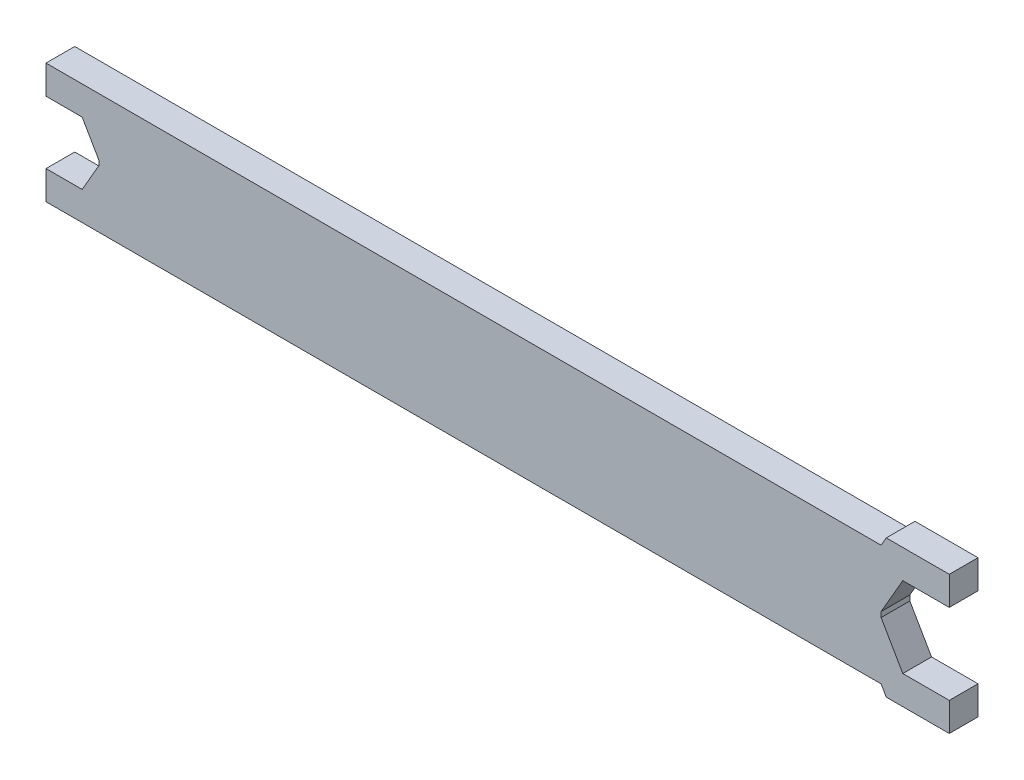
ISO-10303-21;
HEADER;
FILE_DESCRIPTION(('STEP AP214'),'2;1');
FILE_NAME('part.step','',(''),(''),'','','');
FILE_SCHEMA(('AUTOMOTIVE_DESIGN { 1 0 10303 214 1 1 1 1 }'));
ENDSEC;
DATA;
#1=APPLICATION_CONTEXT('core data for automotive mechanical design processes');
#2=APPLICATION_PROTOCOL_DEFINITION('international standard','automotive_design',2000,#1);
#3=PRODUCT_CONTEXT('',#1,'mechanical');
#4=PRODUCT('Part','Part','',(#3));
#5=PRODUCT_RELATED_PRODUCT_CATEGORY('part','',(#4));
#6=PRODUCT_DEFINITION_FORMATION('','',#4);
#7=PRODUCT_DEFINITION_CONTEXT('part definition',#1,'design');
#8=PRODUCT_DEFINITION('design','',#6,#7);
#9=PRODUCT_DEFINITION_SHAPE('','',#8);
#10=(LENGTH_UNIT() NAMED_UNIT(*) SI_UNIT(.MILLI.,.METRE.));
#11=(NAMED_UNIT(*) PLANE_ANGLE_UNIT() SI_UNIT($,.RADIAN.));
#12=(NAMED_UNIT(*) SI_UNIT($,.STERADIAN.) SOLID_ANGLE_UNIT());
#13=UNCERTAINTY_MEASURE_WITH_UNIT(LENGTH_MEASURE(1.E-05),#10,'distance_accuracy_value','');
#14=(GEOMETRIC_REPRESENTATION_CONTEXT(3) GLOBAL_UNCERTAINTY_ASSIGNED_CONTEXT((#13)) GLOBAL_UNIT_ASSIGNED_CONTEXT((#10,
#11,#12)) REPRESENTATION_CONTEXT('',''));
#15=CARTESIAN_POINT('',(0.,0.,0.));
#16=DIRECTION('',(0.,0.,1.));
#17=DIRECTION('',(1.,0.,0.));
#18=AXIS2_PLACEMENT_3D('',#15,#16,#17);
#19=CARTESIAN_POINT('',(51.8707091385298,-29.9475678841873,2.54));
#20=DIRECTION('',(-0.866025403784436,0.500000000000004,0.));
#21=DIRECTION('',(-0.500000000000004,-0.866025403784436,0.));
#22=AXIS2_PLACEMENT_3D('',#19,#20,#21);
#23=PLANE('',#22);
#24=DIRECTION('',(0.,0.,1.));
#25=VECTOR('',#24,1.);
#26=CARTESIAN_POINT('',(72.2258671570601,5.30860000000001,-69.9711463446849));
#27=LINE('',#26,#25);
#28=CARTESIAN_POINT('',(72.2258671570601,5.30860000000001,0.));
#29=VERTEX_POINT('',#28);
#30=CARTESIAN_POINT('',(72.2258671570601,5.30860000000001,2.54));
#31=VERTEX_POINT('',#30);
#32=EDGE_CURVE('E369',#29,#31,#27,.T.);
#33=ORIENTED_EDGE('',*,*,#32,.T.);
#34=DIRECTION('',(0.500000000000004,0.866025403784436,0.));
#35=VECTOR('',#34,1.);
#36=CARTESIAN_POINT('',(51.8707091385298,-29.9475678841873,2.54));
#37=LINE('',#36,#35);
#38=CARTESIAN_POINT('',(72.6804727590201,6.09600000000001,2.54));
#39=VERTEX_POINT('',#38);
#40=EDGE_CURVE('E58',#31,#39,#37,.T.);
#41=ORIENTED_EDGE('',*,*,#40,.T.);
#42=DIRECTION('',(0.,0.,-1.));
#43=VECTOR('',#42,1.);
#44=CARTESIAN_POINT('',(72.6804727590201,6.09600000000001,2.54));
#45=LINE('',#44,#43);
#46=CARTESIAN_POINT('',(72.6804727590201,6.09600000000001,0.));
#47=VERTEX_POINT('',#46);
#48=EDGE_CURVE('E181',#39,#47,#45,.T.);
#49=ORIENTED_EDGE('',*,*,#48,.T.);
#50=DIRECTION('',(0.500000000000004,0.866025403784436,0.));
#51=VECTOR('',#50,1.);
#52=CARTESIAN_POINT('',(51.8707091385298,-29.9475678841873,0.));
#53=LINE('',#52,#51);
#54=EDGE_CURVE('E110',#29,#47,#53,.T.);
#55=ORIENTED_EDGE('',*,*,#54,.F.);
#56=EDGE_LOOP('',(#33,#41,#49,#55));
#57=FACE_BOUND('',#56,.T.);
#58=ADVANCED_FACE('F35',(#57),#23,.T.);
#59=CARTESIAN_POINT('',(0.,5.30860000000001,2.54));
#60=DIRECTION('',(0.,-1.,0.));
#61=DIRECTION('',(0.,0.,-1.));
#62=AXIS2_PLACEMENT_3D('',#59,#60,#61);
#63=PLANE('',#62);
#64=DIRECTION('',(-1.,0.,0.));
#65=VECTOR('',#64,1.);
#66=CARTESIAN_POINT('',(0.,5.30860000000001,0.));
#67=LINE('',#66,#65);
#68=CARTESIAN_POINT('',(-1.59845195527841,5.30860000000001,0.));
#69=VERTEX_POINT('',#68);
#70=EDGE_CURVE('E183',#29,#69,#67,.T.);
#71=ORIENTED_EDGE('',*,*,#70,.T.);
#72=DIRECTION('',(0.,0.,-1.));
#73=VECTOR('',#72,1.);
#74=CARTESIAN_POINT('',(-1.59845195527841,5.30860000000001,2.54));
#75=LINE('',#74,#73);
#76=CARTESIAN_POINT('',(-1.59845195527841,5.30860000000001,2.54));
#77=VERTEX_POINT('',#76);
#78=EDGE_CURVE('E11',#77,#69,#75,.T.);
#79=ORIENTED_EDGE('',*,*,#78,.F.);
#80=DIRECTION('',(-1.,0.,0.));
#81=VECTOR('',#80,1.);
#82=CARTESIAN_POINT('',(0.,5.30860000000001,2.54));
#83=LINE('',#82,#81);
#84=EDGE_CURVE('E116',#31,#77,#83,.T.);
#85=ORIENTED_EDGE('',*,*,#84,.F.);
#86=ORIENTED_EDGE('',*,*,#32,.F.);
#87=EDGE_LOOP('',(#71,#79,#85,#86));
#88=FACE_BOUND('',#87,.T.);
#89=ADVANCED_FACE('F393',(#88),#63,.F.);
#90=CARTESIAN_POINT('',(-1.59845195527841,0.,2.54));
#91=DIRECTION('',(-1.,0.,0.));
#92=DIRECTION('',(0.,0.,1.));
#93=AXIS2_PLACEMENT_3D('',#90,#91,#92);
#94=PLANE('',#93);
#95=DIRECTION('',(0.,1.,0.));
#96=VECTOR('',#95,1.);
#97=CARTESIAN_POINT('',(-1.59845195527841,0.,0.));
#98=LINE('',#97,#96);
#99=CARTESIAN_POINT('',(-1.59845195527841,2.76859999999999,0.));
#100=VERTEX_POINT('',#99);
#101=EDGE_CURVE('E187',#100,#69,#98,.T.);
#102=ORIENTED_EDGE('',*,*,#101,.F.);
#103=DIRECTION('',(0.,0.,-1.));
#104=VECTOR('',#103,1.);
#105=CARTESIAN_POINT('',(-1.59845195527841,2.76859999999999,2.54));
#106=LINE('',#105,#104);
#107=CARTESIAN_POINT('',(-1.59845195527841,2.76859999999999,2.54));
#108=VERTEX_POINT('',#107);
#109=EDGE_CURVE('E42',#108,#100,#106,.T.);
#110=ORIENTED_EDGE('',*,*,#109,.F.);
#111=DIRECTION('',(0.,1.,0.));
#112=VECTOR('',#111,1.);
#113=CARTESIAN_POINT('',(-1.59845195527841,0.,2.54));
#114=LINE('',#113,#112);
#115=EDGE_CURVE('E274',#108,#77,#114,.T.);
#116=ORIENTED_EDGE('',*,*,#115,.T.);
#117=ORIENTED_EDGE('',*,*,#78,.T.);
#118=EDGE_LOOP('',(#102,#110,#116,#117));
#119=FACE_BOUND('',#118,.T.);
#120=ADVANCED_FACE('F260',(#119),#94,.T.);
#121=CARTESIAN_POINT('',(0.,2.7686,2.54));
#122=DIRECTION('',(0.,-1.,0.));
#123=DIRECTION('',(1.,0.,0.));
#124=AXIS2_PLACEMENT_3D('',#121,#122,#123);
#125=PLANE('',#124);
#126=DIRECTION('',(-1.,0.,0.));
#127=VECTOR('',#126,1.);
#128=CARTESIAN_POINT('',(0.,2.7686,0.));
#129=LINE('',#128,#127);
#130=CARTESIAN_POINT('',(1.59845195527839,2.76860000000001,0.));
#131=VERTEX_POINT('',#130);
#132=EDGE_CURVE('E190',#131,#100,#129,.T.);
#133=ORIENTED_EDGE('',*,*,#132,.F.);
#134=DIRECTION('',(0.,0.,-1.));
#135=VECTOR('',#134,1.);
#136=CARTESIAN_POINT('',(1.59845195527839,2.76860000000001,2.54));
#137=LINE('',#136,#135);
#138=CARTESIAN_POINT('',(1.59845195527839,2.76860000000001,2.54));
#139=VERTEX_POINT('',#138);
#140=EDGE_CURVE('E248',#139,#131,#137,.T.);
#141=ORIENTED_EDGE('',*,*,#140,.F.);
#142=DIRECTION('',(-1.,0.,0.));
#143=VECTOR('',#142,1.);
#144=CARTESIAN_POINT('',(0.,2.7686,2.54));
#145=LINE('',#144,#143);
#146=EDGE_CURVE('E257',#139,#108,#145,.T.);
#147=ORIENTED_EDGE('',*,*,#146,.T.);
#148=ORIENTED_EDGE('',*,*,#109,.T.);
#149=EDGE_LOOP('',(#133,#141,#147,#148));
#150=FACE_BOUND('',#149,.T.);
#151=ADVANCED_FACE('F254',(#150),#125,.T.);
#152=CARTESIAN_POINT('',(2.3976779329176,1.3843,2.54));
#153=DIRECTION('',(-0.866025403784438,-0.500000000000001,0.));
#154=DIRECTION('',(0.500000000000001,-0.866025403784438,0.));
#155=AXIS2_PLACEMENT_3D('',#152,#153,#154);
#156=PLANE('',#155);
#157=DIRECTION('',(0.,0.,-1.));
#158=VECTOR('',#157,1.);
#159=CARTESIAN_POINT('',(3.06492163902005,0.228600000000005,2.54));
#160=LINE('',#159,#158);
#161=CARTESIAN_POINT('',(3.06492163902005,0.228600000000008,2.54));
#162=VERTEX_POINT('',#161);
#163=CARTESIAN_POINT('',(3.06492163902005,0.228600000000006,0.));
#164=VERTEX_POINT('',#163);
#165=EDGE_CURVE('E184',#162,#164,#160,.T.);
#166=ORIENTED_EDGE('',*,*,#165,.F.);
#167=DIRECTION('',(-0.500000000000001,0.866025403784438,0.));
#168=VECTOR('',#167,1.);
#169=CARTESIAN_POINT('',(2.3976779329176,1.3843,2.54));
#170=LINE('',#169,#168);
#171=EDGE_CURVE('E271',#162,#139,#170,.T.);
#172=ORIENTED_EDGE('',*,*,#171,.T.);
#173=ORIENTED_EDGE('',*,*,#140,.T.);
#174=DIRECTION('',(-0.500000000000001,0.866025403784438,0.));
#175=VECTOR('',#174,1.);
#176=CARTESIAN_POINT('',(2.3976779329176,1.3843,0.));
#177=LINE('',#176,#175);
#178=EDGE_CURVE('E193',#164,#131,#177,.T.);
#179=ORIENTED_EDGE('',*,*,#178,.F.);
#180=EDGE_LOOP('',(#166,#172,#173,#179));
#181=FACE_BOUND('',#180,.T.);
#182=ADVANCED_FACE('F269',(#181),#156,.T.);
#183=CARTESIAN_POINT('',(2.39767793291761,-1.38429999999999,2.54));
#184=DIRECTION('',(-0.866025403784441,0.499999999999995,0.));
#185=DIRECTION('',(-0.499999999999995,-0.866025403784442,0.));
#186=AXIS2_PLACEMENT_3D('',#183,#184,#185);
#187=PLANE('',#186);
#188=DIRECTION('',(0.,0.,1.));
#189=VECTOR('',#188,1.);
#190=CARTESIAN_POINT('',(3.06492163902005,-0.228600000000009,2.54));
#191=LINE('',#190,#189);
#192=CARTESIAN_POINT('',(3.06492163902005,-0.228600000000009,0.));
#193=VERTEX_POINT('',#192);
#194=CARTESIAN_POINT('',(3.06492163902005,-0.228600000000008,2.54));
#195=VERTEX_POINT('',#194);
#196=EDGE_CURVE('E342',#193,#195,#191,.T.);
#197=ORIENTED_EDGE('',*,*,#196,.F.);
#198=DIRECTION('',(0.499999999999995,0.866025403784442,0.));
#199=VECTOR('',#198,1.);
#200=CARTESIAN_POINT('',(2.39767793291761,-1.38429999999999,0.));
#201=LINE('',#200,#199);
#202=CARTESIAN_POINT('',(1.59845195527843,-2.76859999999998,0.));
#203=VERTEX_POINT('',#202);
#204=EDGE_CURVE('E195',#203,#193,#201,.T.);
#205=ORIENTED_EDGE('',*,*,#204,.F.);
#206=DIRECTION('',(0.,0.,-1.));
#207=VECTOR('',#206,1.);
#208=CARTESIAN_POINT('',(1.59845195527843,-2.76859999999998,2.54));
#209=LINE('',#208,#207);
#210=CARTESIAN_POINT('',(1.59845195527843,-2.76859999999998,2.54));
#211=VERTEX_POINT('',#210);
#212=EDGE_CURVE('E246',#211,#203,#209,.T.);
#213=ORIENTED_EDGE('',*,*,#212,.F.);
#214=DIRECTION('',(0.499999999999995,0.866025403784442,0.));
#215=VECTOR('',#214,1.);
#216=CARTESIAN_POINT('',(2.39767793291761,-1.38429999999999,2.54));
#217=LINE('',#216,#215);
#218=EDGE_CURVE('E276',#211,#195,#217,.T.);
#219=ORIENTED_EDGE('',*,*,#218,.T.);
#220=EDGE_LOOP('',(#197,#205,#213,#219));
#221=FACE_BOUND('',#220,.T.);
#222=ADVANCED_FACE('F351',(#221),#187,.T.);
#223=CARTESIAN_POINT('',(0.,-2.7686,2.54));
#224=DIRECTION('',(0.,1.,0.));
#225=DIRECTION('',(-1.,0.,0.));
#226=AXIS2_PLACEMENT_3D('',#223,#224,#225);
#227=PLANE('',#226);
#228=DIRECTION('',(1.,0.,0.));
#229=VECTOR('',#228,1.);
#230=CARTESIAN_POINT('',(0.,-2.7686,0.));
#231=LINE('',#230,#229);
#232=CARTESIAN_POINT('',(-1.59845195527837,-2.76860000000002,0.));
#233=VERTEX_POINT('',#232);
#234=EDGE_CURVE('E198',#233,#203,#231,.T.);
#235=ORIENTED_EDGE('',*,*,#234,.F.);
#236=DIRECTION('',(0.,0.,-1.));
#237=VECTOR('',#236,1.);
#238=CARTESIAN_POINT('',(-1.59845195527837,-2.76860000000002,2.54));
#239=LINE('',#238,#237);
#240=CARTESIAN_POINT('',(-1.59845195527837,-2.76860000000002,2.54));
#241=VERTEX_POINT('',#240);
#242=EDGE_CURVE('E244',#241,#233,#239,.T.);
#243=ORIENTED_EDGE('',*,*,#242,.F.);
#244=DIRECTION('',(1.,0.,0.));
#245=VECTOR('',#244,1.);
#246=CARTESIAN_POINT('',(0.,-2.7686,2.54));
#247=LINE('',#246,#245);
#248=EDGE_CURVE('E283',#241,#211,#247,.T.);
#249=ORIENTED_EDGE('',*,*,#248,.T.);
#250=ORIENTED_EDGE('',*,*,#212,.T.);
#251=EDGE_LOOP('',(#235,#243,#249,#250));
#252=FACE_BOUND('',#251,.T.);
#253=ADVANCED_FACE('F354',(#252),#227,.T.);
#254=CARTESIAN_POINT('',(-1.59845195527837,0.,2.54));
#255=DIRECTION('',(1.,0.,0.));
#256=DIRECTION('',(0.,0.,-1.));
#257=AXIS2_PLACEMENT_3D('',#254,#255,#256);
#258=PLANE('',#257);
#259=DIRECTION('',(0.,-1.,0.));
#260=VECTOR('',#259,1.);
#261=CARTESIAN_POINT('',(-1.59845195527837,0.,0.));
#262=LINE('',#261,#260);
#263=CARTESIAN_POINT('',(-1.59845195527837,-5.30860000000002,0.));
#264=VERTEX_POINT('',#263);
#265=EDGE_CURVE('E201',#233,#264,#262,.T.);
#266=ORIENTED_EDGE('',*,*,#265,.T.);
#267=DIRECTION('',(0.,0.,-1.));
#268=VECTOR('',#267,1.);
#269=CARTESIAN_POINT('',(-1.59845195527837,-5.30860000000002,2.54));
#270=LINE('',#269,#268);
#271=CARTESIAN_POINT('',(-1.59845195527837,-5.30860000000002,2.54));
#272=VERTEX_POINT('',#271);
#273=EDGE_CURVE('E241',#272,#264,#270,.T.);
#274=ORIENTED_EDGE('',*,*,#273,.F.);
#275=DIRECTION('',(0.,-1.,0.));
#276=VECTOR('',#275,1.);
#277=CARTESIAN_POINT('',(-1.59845195527837,0.,2.54));
#278=LINE('',#277,#276);
#279=EDGE_CURVE('E286',#241,#272,#278,.T.);
#280=ORIENTED_EDGE('',*,*,#279,.F.);
#281=ORIENTED_EDGE('',*,*,#242,.T.);
#282=EDGE_LOOP('',(#266,#274,#280,#281));
#283=FACE_BOUND('',#282,.T.);
#284=ADVANCED_FACE('F358',(#283),#258,.F.);
#285=CARTESIAN_POINT('',(0.,-5.30860000000002,2.54));
#286=DIRECTION('',(0.,1.,0.));
#287=DIRECTION('',(0.,0.,1.));
#288=AXIS2_PLACEMENT_3D('',#285,#286,#287);
#289=PLANE('',#288);
#290=DIRECTION('',(1.,0.,0.));
#291=VECTOR('',#290,1.);
#292=CARTESIAN_POINT('',(0.,-5.30860000000002,0.));
#293=LINE('',#292,#291);
#294=CARTESIAN_POINT('',(72.2258671570601,-5.30860000000002,0.));
#295=VERTEX_POINT('',#294);
#296=EDGE_CURVE('E203',#264,#295,#293,.T.);
#297=ORIENTED_EDGE('',*,*,#296,.T.);
#298=DIRECTION('',(0.,0.,1.));
#299=VECTOR('',#298,1.);
#300=CARTESIAN_POINT('',(72.2258671570601,-5.30860000000002,-69.9711463446849));
#301=LINE('',#300,#299);
#302=CARTESIAN_POINT('',(72.2258671570601,-5.30860000000002,2.54));
#303=VERTEX_POINT('',#302);
#304=EDGE_CURVE('E365',#295,#303,#301,.T.);
#305=ORIENTED_EDGE('',*,*,#304,.T.);
#306=DIRECTION('',(1.,0.,0.));
#307=VECTOR('',#306,1.);
#308=CARTESIAN_POINT('',(0.,-5.30860000000002,2.54));
#309=LINE('',#308,#307);
#310=EDGE_CURVE('E49',#272,#303,#309,.T.);
#311=ORIENTED_EDGE('',*,*,#310,.F.);
#312=ORIENTED_EDGE('',*,*,#273,.T.);
#313=EDGE_LOOP('',(#297,#305,#311,#312));
#314=FACE_BOUND('',#313,.T.);
#315=ADVANCED_FACE('F363',(#314),#289,.F.);
#316=CARTESIAN_POINT('',(51.8707091385302,29.947567884187,2.54));
#317=DIRECTION('',(0.86602540378444,0.499999999999998,0.));
#318=DIRECTION('',(-0.499999999999998,0.86602540378444,0.));
#319=AXIS2_PLACEMENT_3D('',#316,#317,#318);
#320=PLANE('',#319);
#321=DIRECTION('',(0.499999999999998,-0.86602540378444,0.));
#322=VECTOR('',#321,1.);
#323=CARTESIAN_POINT('',(51.8707091385302,29.947567884187,2.54));
#324=LINE('',#323,#322);
#325=CARTESIAN_POINT('',(72.68047275902,-6.09599999999999,2.54));
#326=VERTEX_POINT('',#325);
#327=EDGE_CURVE('E289',#303,#326,#324,.T.);
#328=ORIENTED_EDGE('',*,*,#327,.F.);
#329=ORIENTED_EDGE('',*,*,#304,.F.);
#330=DIRECTION('',(0.499999999999998,-0.86602540378444,0.));
#331=VECTOR('',#330,1.);
#332=CARTESIAN_POINT('',(51.8707091385302,29.947567884187,0.));
#333=LINE('',#332,#331);
#334=CARTESIAN_POINT('',(72.68047275902,-6.09599999999999,0.));
#335=VERTEX_POINT('',#334);
#336=EDGE_CURVE('E206',#295,#335,#333,.T.);
#337=ORIENTED_EDGE('',*,*,#336,.T.);
#338=DIRECTION('',(0.,0.,-1.));
#339=VECTOR('',#338,1.);
#340=CARTESIAN_POINT('',(72.68047275902,-6.09599999999999,2.54));
#341=LINE('',#340,#339);
#342=EDGE_CURVE('E238',#326,#335,#341,.T.);
#343=ORIENTED_EDGE('',*,*,#342,.F.);
#344=EDGE_LOOP('',(#328,#329,#337,#343));
#345=FACE_BOUND('',#344,.T.);
#346=ADVANCED_FACE('F417',(#345),#320,.F.);
#347=CARTESIAN_POINT('',(0.,-6.09599999999975,2.54));
#348=DIRECTION('',(0.,1.,0.));
#349=DIRECTION('',(-1.,0.,0.));
#350=AXIS2_PLACEMENT_3D('',#347,#348,#349);
#351=PLANE('',#350);
#352=DIRECTION('',(1.,0.,0.));
#353=VECTOR('',#352,1.);
#354=CARTESIAN_POINT('',(0.,-6.09599999999975,0.));
#355=LINE('',#354,#353);
#356=CARTESIAN_POINT('',(78.2530575572383,-6.09600000000001,0.));
#357=VERTEX_POINT('',#356);
#358=EDGE_CURVE('E208',#335,#357,#355,.T.);
#359=ORIENTED_EDGE('',*,*,#358,.T.);
#360=DIRECTION('',(0.,0.,-1.));
#361=VECTOR('',#360,1.);
#362=CARTESIAN_POINT('',(78.2530575572383,-6.09600000000001,2.54));
#363=LINE('',#362,#361);
#364=CARTESIAN_POINT('',(78.2530575572383,-6.09600000000001,2.54));
#365=VERTEX_POINT('',#364);
#366=EDGE_CURVE('E236',#365,#357,#363,.T.);
#367=ORIENTED_EDGE('',*,*,#366,.F.);
#368=DIRECTION('',(1.,0.,0.));
#369=VECTOR('',#368,1.);
#370=CARTESIAN_POINT('',(0.,-6.09599999999975,2.54));
#371=LINE('',#370,#369);
#372=EDGE_CURVE('E291',#326,#365,#371,.T.);
#373=ORIENTED_EDGE('',*,*,#372,.F.);
#374=ORIENTED_EDGE('',*,*,#342,.T.);
#375=EDGE_LOOP('',(#359,#367,#373,#374));
#376=FACE_BOUND('',#375,.T.);
#377=ADVANCED_FACE('F420',(#376),#351,.F.);
#378=CARTESIAN_POINT('',(78.2530575572383,0.,2.54));
#379=DIRECTION('',(1.,0.,0.));
#380=DIRECTION('',(0.,0.,-1.));
#381=AXIS2_PLACEMENT_3D('',#378,#379,#380);
#382=PLANE('',#381);
#383=DIRECTION('',(0.,-1.,0.));
#384=VECTOR('',#383,1.);
#385=CARTESIAN_POINT('',(78.2530575572383,0.,0.));
#386=LINE('',#385,#384);
#387=CARTESIAN_POINT('',(78.2530575572383,-3.55600000000001,0.));
#388=VERTEX_POINT('',#387);
#389=EDGE_CURVE('E211',#388,#357,#386,.T.);
#390=ORIENTED_EDGE('',*,*,#389,.F.);
#391=DIRECTION('',(0.,0.,-1.));
#392=VECTOR('',#391,1.);
#393=CARTESIAN_POINT('',(78.2530575572383,-3.55600000000001,2.54));
#394=LINE('',#393,#392);
#395=CARTESIAN_POINT('',(78.2530575572383,-3.55600000000001,2.54));
#396=VERTEX_POINT('',#395);
#397=EDGE_CURVE('E234',#396,#388,#394,.T.);
#398=ORIENTED_EDGE('',*,*,#397,.F.);
#399=DIRECTION('',(0.,-1.,0.));
#400=VECTOR('',#399,1.);
#401=CARTESIAN_POINT('',(78.2530575572383,0.,2.54));
#402=LINE('',#401,#400);
#403=EDGE_CURVE('E293',#396,#365,#402,.T.);
#404=ORIENTED_EDGE('',*,*,#403,.T.);
#405=ORIENTED_EDGE('',*,*,#366,.T.);
#406=EDGE_LOOP('',(#390,#398,#404,#405));
#407=FACE_BOUND('',#406,.T.);
#408=ADVANCED_FACE('F316',(#407),#382,.T.);
#409=CARTESIAN_POINT('',(0.,-3.55599999999976,2.54));
#410=DIRECTION('',(0.,1.,0.));
#411=DIRECTION('',(-1.,0.,0.));
#412=AXIS2_PLACEMENT_3D('',#409,#410,#411);
#413=PLANE('',#412);
#414=DIRECTION('',(1.,0.,0.));
#415=VECTOR('',#414,1.);
#416=CARTESIAN_POINT('',(0.,-3.55599999999976,0.));
#417=LINE('',#416,#415);
#418=CARTESIAN_POINT('',(74.1469424427617,-3.556,0.));
#419=VERTEX_POINT('',#418);
#420=EDGE_CURVE('E214',#419,#388,#417,.T.);
#421=ORIENTED_EDGE('',*,*,#420,.F.);
#422=DIRECTION('',(0.,0.,-1.));
#423=VECTOR('',#422,1.);
#424=CARTESIAN_POINT('',(74.1469424427617,-3.556,2.54));
#425=LINE('',#424,#423);
#426=CARTESIAN_POINT('',(74.1469424427617,-3.556,2.54));
#427=VERTEX_POINT('',#426);
#428=EDGE_CURVE('E231',#427,#419,#425,.T.);
#429=ORIENTED_EDGE('',*,*,#428,.F.);
#430=DIRECTION('',(1.,0.,0.));
#431=VECTOR('',#430,1.);
#432=CARTESIAN_POINT('',(0.,-3.55599999999976,2.54));
#433=LINE('',#432,#431);
#434=EDGE_CURVE('E296',#427,#396,#433,.T.);
#435=ORIENTED_EDGE('',*,*,#434,.T.);
#436=ORIENTED_EDGE('',*,*,#397,.T.);
#437=EDGE_LOOP('',(#421,#429,#435,#436));
#438=FACE_BOUND('',#437,.T.);
#439=ADVANCED_FACE('F310',(#438),#413,.T.);
#440=CARTESIAN_POINT('',(54.0704136641425,31.2175678841871,2.54));
#441=DIRECTION('',(0.866025403784439,0.5,0.));
#442=DIRECTION('',(-0.5,0.866025403784439,0.));
#443=AXIS2_PLACEMENT_3D('',#440,#441,#442);
#444=PLANE('',#443);
#445=DIRECTION('',(0.,0.,-1.));
#446=VECTOR('',#445,1.);
#447=CARTESIAN_POINT('',(72.2258671570601,-0.228600000000009,2.54));
#448=LINE('',#447,#446);
#449=CARTESIAN_POINT('',(72.2258671570601,-0.228600000000001,2.54));
#450=VERTEX_POINT('',#449);
#451=CARTESIAN_POINT('',(72.2258671570601,-0.228600000000002,0.));
#452=VERTEX_POINT('',#451);
#453=EDGE_CURVE('E307',#450,#452,#448,.T.);
#454=ORIENTED_EDGE('',*,*,#453,.F.);
#455=DIRECTION('',(0.5,-0.866025403784439,0.));
#456=VECTOR('',#455,1.);
#457=CARTESIAN_POINT('',(54.0704136641425,31.2175678841871,2.54));
#458=LINE('',#457,#456);
#459=EDGE_CURVE('E176',#450,#427,#458,.T.);
#460=ORIENTED_EDGE('',*,*,#459,.T.);
#461=ORIENTED_EDGE('',*,*,#428,.T.);
#462=DIRECTION('',(0.5,-0.866025403784439,0.));
#463=VECTOR('',#462,1.);
#464=CARTESIAN_POINT('',(54.0704136641425,31.2175678841871,0.));
#465=LINE('',#464,#463);
#466=EDGE_CURVE('E217',#452,#419,#465,.T.);
#467=ORIENTED_EDGE('',*,*,#466,.F.);
#468=EDGE_LOOP('',(#454,#460,#461,#467));
#469=FACE_BOUND('',#468,.T.);
#470=ADVANCED_FACE('F302',(#469),#444,.T.);
#471=CARTESIAN_POINT('',(54.0704136641422,-31.2175678841873,2.54));
#472=DIRECTION('',(0.866025403784436,-0.500000000000005,0.));
#473=DIRECTION('',(0.500000000000005,0.866025403784436,0.));
#474=AXIS2_PLACEMENT_3D('',#471,#472,#473);
#475=PLANE('',#474);
#476=DIRECTION('',(0.,0.,1.));
#477=VECTOR('',#476,1.);
#478=CARTESIAN_POINT('',(72.2258671570601,0.228599999999989,2.54));
#479=LINE('',#478,#477);
#480=CARTESIAN_POINT('',(72.2258671570601,0.228599999999982,0.));
#481=VERTEX_POINT('',#480);
#482=CARTESIAN_POINT('',(72.2258671570601,0.228599999999983,2.54));
#483=VERTEX_POINT('',#482);
#484=EDGE_CURVE('E374',#481,#483,#479,.T.);
#485=ORIENTED_EDGE('',*,*,#484,.F.);
#486=DIRECTION('',(-0.500000000000005,-0.866025403784436,0.));
#487=VECTOR('',#486,1.);
#488=CARTESIAN_POINT('',(54.0704136641422,-31.2175678841873,0.));
#489=LINE('',#488,#487);
#490=CARTESIAN_POINT('',(74.1469424427617,3.556,0.));
#491=VERTEX_POINT('',#490);
#492=EDGE_CURVE('E219',#491,#481,#489,.T.);
#493=ORIENTED_EDGE('',*,*,#492,.F.);
#494=DIRECTION('',(0.,0.,-1.));
#495=VECTOR('',#494,1.);
#496=CARTESIAN_POINT('',(74.1469424427617,3.556,2.54));
#497=LINE('',#496,#495);
#498=CARTESIAN_POINT('',(74.1469424427617,3.556,2.54));
#499=VERTEX_POINT('',#498);
#500=EDGE_CURVE('E160',#499,#491,#497,.T.);
#501=ORIENTED_EDGE('',*,*,#500,.F.);
#502=DIRECTION('',(-0.500000000000005,-0.866025403784436,0.));
#503=VECTOR('',#502,1.);
#504=CARTESIAN_POINT('',(54.0704136641422,-31.2175678841873,2.54));
#505=LINE('',#504,#503);
#506=EDGE_CURVE('E174',#499,#483,#505,.T.);
#507=ORIENTED_EDGE('',*,*,#506,.T.);
#508=EDGE_LOOP('',(#485,#493,#501,#507));
#509=FACE_BOUND('',#508,.T.);
#510=ADVANCED_FACE('F384',(#509),#475,.T.);
#511=CARTESIAN_POINT('',(0.,3.55600000000025,2.54));
#512=DIRECTION('',(0.,-1.,0.));
#513=DIRECTION('',(1.,0.,0.));
#514=AXIS2_PLACEMENT_3D('',#511,#512,#513);
#515=PLANE('',#514);
#516=DIRECTION('',(-1.,0.,0.));
#517=VECTOR('',#516,1.);
#518=CARTESIAN_POINT('',(0.,3.55600000000025,0.));
#519=LINE('',#518,#517);
#520=CARTESIAN_POINT('',(78.2530575572383,3.55599999999999,0.));
#521=VERTEX_POINT('',#520);
#522=EDGE_CURVE('E157',#521,#491,#519,.T.);
#523=ORIENTED_EDGE('',*,*,#522,.F.);
#524=DIRECTION('',(0.,0.,-1.));
#525=VECTOR('',#524,1.);
#526=CARTESIAN_POINT('',(78.2530575572383,3.55599999999999,2.54));
#527=LINE('',#526,#525);
#528=CARTESIAN_POINT('',(78.2530575572383,3.55599999999999,2.54));
#529=VERTEX_POINT('',#528);
#530=EDGE_CURVE('E151',#529,#521,#527,.T.);
#531=ORIENTED_EDGE('',*,*,#530,.F.);
#532=DIRECTION('',(-1.,0.,0.));
#533=VECTOR('',#532,1.);
#534=CARTESIAN_POINT('',(0.,3.55600000000025,2.54));
#535=LINE('',#534,#533);
#536=EDGE_CURVE('E155',#529,#499,#535,.T.);
#537=ORIENTED_EDGE('',*,*,#536,.T.);
#538=ORIENTED_EDGE('',*,*,#500,.T.);
#539=EDGE_LOOP('',(#523,#531,#537,#538));
#540=FACE_BOUND('',#539,.T.);
#541=ADVANCED_FACE('F153',(#540),#515,.T.);
#542=CARTESIAN_POINT('',(78.2530575572383,0.,2.54));
#543=DIRECTION('',(-1.,0.,0.));
#544=DIRECTION('',(0.,0.,1.));
#545=AXIS2_PLACEMENT_3D('',#542,#543,#544);
#546=PLANE('',#545);
#547=DIRECTION('',(0.,1.,0.));
#548=VECTOR('',#547,1.);
#549=CARTESIAN_POINT('',(78.2530575572383,0.,0.));
#550=LINE('',#549,#548);
#551=CARTESIAN_POINT('',(78.2530575572383,6.09599999999999,0.));
#552=VERTEX_POINT('',#551);
#553=EDGE_CURVE('E223',#521,#552,#550,.T.);
#554=ORIENTED_EDGE('',*,*,#553,.T.);
#555=DIRECTION('',(0.,0.,-1.));
#556=VECTOR('',#555,1.);
#557=CARTESIAN_POINT('',(78.2530575572383,6.09599999999999,2.54));
#558=LINE('',#557,#556);
#559=CARTESIAN_POINT('',(78.2530575572383,6.09599999999999,2.54));
#560=VERTEX_POINT('',#559);
#561=EDGE_CURVE('E161',#560,#552,#558,.T.);
#562=ORIENTED_EDGE('',*,*,#561,.F.);
#563=DIRECTION('',(0.,1.,0.));
#564=VECTOR('',#563,1.);
#565=CARTESIAN_POINT('',(78.2530575572383,0.,2.54));
#566=LINE('',#565,#564);
#567=EDGE_CURVE('E164',#529,#560,#566,.T.);
#568=ORIENTED_EDGE('',*,*,#567,.F.);
#569=ORIENTED_EDGE('',*,*,#530,.T.);
#570=EDGE_LOOP('',(#554,#562,#568,#569));
#571=FACE_BOUND('',#570,.T.);
#572=ADVANCED_FACE('F165',(#571),#546,.F.);
#573=CARTESIAN_POINT('',(0.,6.09600000000026,2.54));
#574=DIRECTION('',(0.,-1.,0.));
#575=DIRECTION('',(1.,0.,0.));
#576=AXIS2_PLACEMENT_3D('',#573,#574,#575);
#577=PLANE('',#576);
#578=DIRECTION('',(-1.,0.,0.));
#579=VECTOR('',#578,1.);
#580=CARTESIAN_POINT('',(0.,6.09600000000026,0.));
#581=LINE('',#580,#579);
#582=EDGE_CURVE('E225',#552,#47,#581,.T.);
#583=ORIENTED_EDGE('',*,*,#582,.T.);
#584=ORIENTED_EDGE('',*,*,#48,.F.);
#585=DIRECTION('',(-1.,0.,0.));
#586=VECTOR('',#585,1.);
#587=CARTESIAN_POINT('',(0.,6.09600000000026,2.54));
#588=LINE('',#587,#586);
#589=EDGE_CURVE('E168',#560,#39,#588,.T.);
#590=ORIENTED_EDGE('',*,*,#589,.F.);
#591=ORIENTED_EDGE('',*,*,#561,.T.);
#592=EDGE_LOOP('',(#583,#584,#590,#591));
#593=FACE_BOUND('',#592,.T.);
#594=ADVANCED_FACE('F386',(#593),#577,.F.);
#595=CARTESIAN_POINT('',(0.,0.,2.54));
#596=DIRECTION('',(0.,0.,1.));
#597=DIRECTION('',(1.,0.,0.));
#598=AXIS2_PLACEMENT_3D('',#595,#596,#597);
#599=PLANE('',#598);
#600=ORIENTED_EDGE('',*,*,#40,.F.);
#601=ORIENTED_EDGE('',*,*,#84,.T.);
#602=ORIENTED_EDGE('',*,*,#115,.F.);
#603=ORIENTED_EDGE('',*,*,#146,.F.);
#604=ORIENTED_EDGE('',*,*,#171,.F.);
#605=DIRECTION('',(0.,-1.,0.));
#606=VECTOR('',#605,1.);
#607=CARTESIAN_POINT('',(3.06492163902005,5.30860000000001,2.54));
#608=LINE('',#607,#606);
#609=EDGE_CURVE('E340',#162,#195,#608,.T.);
#610=ORIENTED_EDGE('',*,*,#609,.T.);
#611=ORIENTED_EDGE('',*,*,#218,.F.);
#612=ORIENTED_EDGE('',*,*,#248,.F.);
#613=ORIENTED_EDGE('',*,*,#279,.T.);
#614=ORIENTED_EDGE('',*,*,#310,.T.);
#615=ORIENTED_EDGE('',*,*,#327,.T.);
#616=ORIENTED_EDGE('',*,*,#372,.T.);
#617=ORIENTED_EDGE('',*,*,#403,.F.);
#618=ORIENTED_EDGE('',*,*,#434,.F.);
#619=ORIENTED_EDGE('',*,*,#459,.F.);
#620=DIRECTION('',(0.,1.,0.));
#621=VECTOR('',#620,1.);
#622=CARTESIAN_POINT('',(72.2258671570601,5.30860000000001,2.54));
#623=LINE('',#622,#621);
#624=EDGE_CURVE('E349',#450,#483,#623,.T.);
#625=ORIENTED_EDGE('',*,*,#624,.T.);
#626=ORIENTED_EDGE('',*,*,#506,.F.);
#627=ORIENTED_EDGE('',*,*,#536,.F.);
#628=ORIENTED_EDGE('',*,*,#567,.T.);
#629=ORIENTED_EDGE('',*,*,#589,.T.);
#630=EDGE_LOOP('',(#600,#601,#602,#603,#604,#610,#611,#612,#613,#614,#615,#616,#617,#618,#619,
#625,#626,#627,#628,#629));
#631=FACE_BOUND('',#630,.T.);
#632=ADVANCED_FACE('F171',(#631),#599,.T.);
#633=CARTESIAN_POINT('',(0.,0.,0.));
#634=DIRECTION('',(0.,0.,1.));
#635=DIRECTION('',(1.,0.,0.));
#636=AXIS2_PLACEMENT_3D('',#633,#634,#635);
#637=PLANE('',#636);
#638=ORIENTED_EDGE('',*,*,#70,.F.);
#639=ORIENTED_EDGE('',*,*,#54,.T.);
#640=ORIENTED_EDGE('',*,*,#582,.F.);
#641=ORIENTED_EDGE('',*,*,#553,.F.);
#642=ORIENTED_EDGE('',*,*,#522,.T.);
#643=ORIENTED_EDGE('',*,*,#492,.T.);
#644=DIRECTION('',(0.,-1.,0.));
#645=VECTOR('',#644,1.);
#646=CARTESIAN_POINT('',(72.2258671570601,5.30860000000001,0.));
#647=LINE('',#646,#645);
#648=EDGE_CURVE('E321',#481,#452,#647,.T.);
#649=ORIENTED_EDGE('',*,*,#648,.T.);
#650=ORIENTED_EDGE('',*,*,#466,.T.);
#651=ORIENTED_EDGE('',*,*,#420,.T.);
#652=ORIENTED_EDGE('',*,*,#389,.T.);
#653=ORIENTED_EDGE('',*,*,#358,.F.);
#654=ORIENTED_EDGE('',*,*,#336,.F.);
#655=ORIENTED_EDGE('',*,*,#296,.F.);
#656=ORIENTED_EDGE('',*,*,#265,.F.);
#657=ORIENTED_EDGE('',*,*,#234,.T.);
#658=ORIENTED_EDGE('',*,*,#204,.T.);
#659=DIRECTION('',(0.,1.,0.));
#660=VECTOR('',#659,1.);
#661=CARTESIAN_POINT('',(3.06492163902005,5.30860000000001,0.));
#662=LINE('',#661,#660);
#663=EDGE_CURVE('E266',#193,#164,#662,.T.);
#664=ORIENTED_EDGE('',*,*,#663,.T.);
#665=ORIENTED_EDGE('',*,*,#178,.T.);
#666=ORIENTED_EDGE('',*,*,#132,.T.);
#667=ORIENTED_EDGE('',*,*,#101,.T.);
#668=EDGE_LOOP('',(#638,#639,#640,#641,#642,#643,#649,#650,#651,#652,#653,#654,#655,#656,#657,
#658,#664,#665,#666,#667));
#669=FACE_BOUND('',#668,.T.);
#670=ADVANCED_FACE('F261',(#669),#637,.F.);
#671=CARTESIAN_POINT('',(72.2258671570601,5.30860000000001,-69.9711463446849));
#672=DIRECTION('',(1.,0.,0.));
#673=DIRECTION('',(0.,0.,-1.));
#674=AXIS2_PLACEMENT_3D('',#671,#672,#673);
#675=PLANE('',#674);
#676=ORIENTED_EDGE('',*,*,#624,.F.);
#677=ORIENTED_EDGE('',*,*,#453,.T.);
#678=ORIENTED_EDGE('',*,*,#648,.F.);
#679=ORIENTED_EDGE('',*,*,#484,.T.);
#680=EDGE_LOOP('',(#676,#677,#678,#679));
#681=FACE_BOUND('',#680,.T.);
#682=ADVANCED_FACE('F381',(#681),#675,.T.);
#683=CARTESIAN_POINT('',(3.06492163902005,5.30860000000001,-69.9711463446849));
#684=DIRECTION('',(-1.,0.,0.));
#685=DIRECTION('',(0.,0.,1.));
#686=AXIS2_PLACEMENT_3D('',#683,#684,#685);
#687=PLANE('',#686);
#688=ORIENTED_EDGE('',*,*,#609,.F.);
#689=ORIENTED_EDGE('',*,*,#165,.T.);
#690=ORIENTED_EDGE('',*,*,#663,.F.);
#691=ORIENTED_EDGE('',*,*,#196,.T.);
#692=EDGE_LOOP('',(#688,#689,#690,#691));
#693=FACE_BOUND('',#692,.T.);
#694=ADVANCED_FACE('F343',(#693),#687,.T.);
#695=CLOSED_SHELL('',(#58,#89,#120,#151,#182,#222,#253,#284,#315,#346,#377,#408,#439,#470,#510,
#541,#572,#594,#632,#670,#682,#694));
#696=MANIFOLD_SOLID_BREP('B2',#695);
#697=ADVANCED_BREP_SHAPE_REPRESENTATION('',(#18,#696),#14);
#698=SHAPE_DEFINITION_REPRESENTATION(#9,#697);
ENDSEC;
END-ISO-10303-21;
